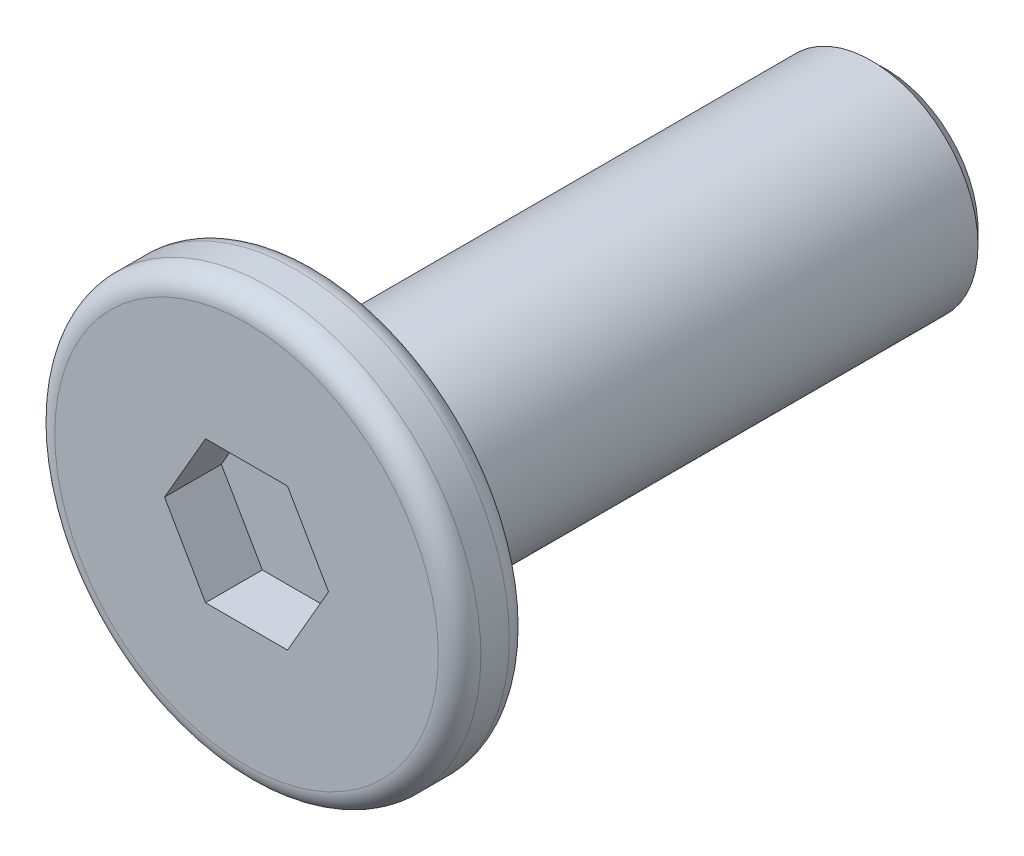
ISO-10303-21;
HEADER;
FILE_DESCRIPTION(('STEP AP214'),'2;1');
FILE_NAME('part.step','',(''),(''),'','','');
FILE_SCHEMA(('AUTOMOTIVE_DESIGN { 1 0 10303 214 1 1 1 1 }'));
ENDSEC;
DATA;
#1=APPLICATION_CONTEXT('core data for automotive mechanical design processes');
#2=APPLICATION_PROTOCOL_DEFINITION('international standard','automotive_design',2000,#1);
#3=PRODUCT_CONTEXT('',#1,'mechanical');
#4=PRODUCT('Part','Part','',(#3));
#5=PRODUCT_RELATED_PRODUCT_CATEGORY('part','',(#4));
#6=PRODUCT_DEFINITION_FORMATION('','',#4);
#7=PRODUCT_DEFINITION_CONTEXT('part definition',#1,'design');
#8=PRODUCT_DEFINITION('design','',#6,#7);
#9=PRODUCT_DEFINITION_SHAPE('','',#8);
#10=(LENGTH_UNIT() NAMED_UNIT(*) SI_UNIT(.MILLI.,.METRE.));
#11=(NAMED_UNIT(*) PLANE_ANGLE_UNIT() SI_UNIT($,.RADIAN.));
#12=(NAMED_UNIT(*) SI_UNIT($,.STERADIAN.) SOLID_ANGLE_UNIT());
#13=UNCERTAINTY_MEASURE_WITH_UNIT(LENGTH_MEASURE(1.E-05),#10,'distance_accuracy_value','');
#14=(GEOMETRIC_REPRESENTATION_CONTEXT(3) GLOBAL_UNCERTAINTY_ASSIGNED_CONTEXT((#13)) GLOBAL_UNIT_ASSIGNED_CONTEXT((#10,
#11,#12)) REPRESENTATION_CONTEXT('',''));
#15=CARTESIAN_POINT('',(0.,0.,0.));
#16=DIRECTION('',(0.,0.,1.));
#17=DIRECTION('',(1.,0.,0.));
#18=AXIS2_PLACEMENT_3D('',#15,#16,#17);
#19=CARTESIAN_POINT('',(0.,0.,0.5));
#20=DIRECTION('',(0.,0.,-1.));
#21=DIRECTION('',(-1.,0.,0.));
#22=AXIS2_PLACEMENT_3D('',#19,#20,#21);
#23=CYLINDRICAL_SURFACE('',#22,3.);
#24=CARTESIAN_POINT('',(0.,0.,-0.2));
#25=DIRECTION('',(0.,0.,1.));
#26=DIRECTION('',(1.,0.,0.));
#27=AXIS2_PLACEMENT_3D('',#24,#25,#26);
#28=CIRCLE('',#27,3.);
#29=CARTESIAN_POINT('',(3.,0.,-0.2));
#30=VERTEX_POINT('',#29);
#31=EDGE_CURVE('E156',#30,#30,#28,.T.);
#32=ORIENTED_EDGE('',*,*,#31,.T.);
#33=EDGE_LOOP('',(#32));
#34=FACE_BOUND('',#33,.T.);
#35=CARTESIAN_POINT('',(0.,0.,0.2));
#36=DIRECTION('',(0.,0.,1.));
#37=DIRECTION('',(1.,0.,0.));
#38=AXIS2_PLACEMENT_3D('',#35,#36,#37);
#39=CIRCLE('',#38,3.);
#40=CARTESIAN_POINT('',(3.,0.,0.2));
#41=VERTEX_POINT('',#40);
#42=EDGE_CURVE('E153',#41,#41,#39,.F.);
#43=ORIENTED_EDGE('',*,*,#42,.T.);
#44=EDGE_LOOP('',(#43));
#45=FACE_BOUND('',#44,.T.);
#46=ADVANCED_FACE('F37',(#34,#45),#23,.T.);
#47=CARTESIAN_POINT('',(0.,0.,0.5));
#48=DIRECTION('',(0.,0.,1.));
#49=DIRECTION('',(1.,0.,0.));
#50=AXIS2_PLACEMENT_3D('',#47,#48,#49);
#51=PLANE('',#50);
#52=CARTESIAN_POINT('',(0.,0.,0.5));
#53=DIRECTION('',(0.,0.,1.));
#54=DIRECTION('',(1.,0.,0.));
#55=AXIS2_PLACEMENT_3D('',#52,#53,#54);
#56=CIRCLE('',#55,2.7);
#57=CARTESIAN_POINT('',(2.7,0.,0.5));
#58=VERTEX_POINT('',#57);
#59=EDGE_CURVE('E11',#58,#58,#56,.T.);
#60=ORIENTED_EDGE('',*,*,#59,.T.);
#61=EDGE_LOOP('',(#60));
#62=FACE_BOUND('',#61,.T.);
#63=DIRECTION('',(0.5,0.866025403784439,0.));
#64=VECTOR('',#63,1.);
#65=CARTESIAN_POINT('',(0.577350269189626,-1.,0.5));
#66=LINE('',#65,#64);
#67=CARTESIAN_POINT('',(0.577350269189626,-1.,0.5));
#68=VERTEX_POINT('',#67);
#69=CARTESIAN_POINT('',(1.15470053837925,0.,0.5));
#70=VERTEX_POINT('',#69);
#71=EDGE_CURVE('E52',#68,#70,#66,.T.);
#72=ORIENTED_EDGE('',*,*,#71,.F.);
#73=DIRECTION('',(1.,0.,0.));
#74=VECTOR('',#73,1.);
#75=CARTESIAN_POINT('',(-0.577350269189625,-1.,0.5));
#76=LINE('',#75,#74);
#77=CARTESIAN_POINT('',(-0.577350269189625,-1.,0.5));
#78=VERTEX_POINT('',#77);
#79=EDGE_CURVE('E135',#78,#68,#76,.T.);
#80=ORIENTED_EDGE('',*,*,#79,.F.);
#81=DIRECTION('',(0.5,-0.866025403784438,0.));
#82=VECTOR('',#81,1.);
#83=CARTESIAN_POINT('',(-1.15470053837925,0.,0.5));
#84=LINE('',#83,#82);
#85=CARTESIAN_POINT('',(-1.15470053837925,0.,0.5));
#86=VERTEX_POINT('',#85);
#87=EDGE_CURVE('E133',#86,#78,#84,.T.);
#88=ORIENTED_EDGE('',*,*,#87,.F.);
#89=DIRECTION('',(-0.5,-0.866025403784438,0.));
#90=VECTOR('',#89,1.);
#91=CARTESIAN_POINT('',(-0.577350269189626,1.,0.5));
#92=LINE('',#91,#90);
#93=CARTESIAN_POINT('',(-0.577350269189626,1.,0.5));
#94=VERTEX_POINT('',#93);
#95=EDGE_CURVE('E100',#94,#86,#92,.T.);
#96=ORIENTED_EDGE('',*,*,#95,.F.);
#97=DIRECTION('',(-1.,0.,0.));
#98=VECTOR('',#97,1.);
#99=CARTESIAN_POINT('',(0.577350269189625,1.,0.5));
#100=LINE('',#99,#98);
#101=CARTESIAN_POINT('',(0.577350269189625,1.,0.5));
#102=VERTEX_POINT('',#101);
#103=EDGE_CURVE('E129',#102,#94,#100,.T.);
#104=ORIENTED_EDGE('',*,*,#103,.F.);
#105=DIRECTION('',(-0.5,0.866025403784438,0.));
#106=VECTOR('',#105,1.);
#107=CARTESIAN_POINT('',(1.15470053837925,0.,0.5));
#108=LINE('',#107,#106);
#109=EDGE_CURVE('E126',#70,#102,#108,.T.);
#110=ORIENTED_EDGE('',*,*,#109,.F.);
#111=EDGE_LOOP('',(#72,#80,#88,#96,#104,#110));
#112=FACE_BOUND('',#111,.T.);
#113=ADVANCED_FACE('F171',(#62,#112),#51,.T.);
#114=CARTESIAN_POINT('',(0.,0.,-0.5));
#115=DIRECTION('',(0.,0.,1.));
#116=DIRECTION('',(1.,0.,0.));
#117=AXIS2_PLACEMENT_3D('',#114,#115,#116);
#118=PLANE('',#117);
#119=CARTESIAN_POINT('',(0.,0.,-0.5));
#120=DIRECTION('',(0.,0.,1.));
#121=DIRECTION('',(1.,0.,0.));
#122=AXIS2_PLACEMENT_3D('',#119,#120,#121);
#123=CIRCLE('',#122,2.7);
#124=CARTESIAN_POINT('',(2.7,0.,-0.5));
#125=VERTEX_POINT('',#124);
#126=EDGE_CURVE('E45',#125,#125,#123,.F.);
#127=ORIENTED_EDGE('',*,*,#126,.T.);
#128=EDGE_LOOP('',(#127));
#129=FACE_BOUND('',#128,.T.);
#130=CARTESIAN_POINT('',(0.,0.,-0.5));
#131=DIRECTION('',(0.,0.,-1.));
#132=DIRECTION('',(-1.,0.,0.));
#133=AXIS2_PLACEMENT_3D('',#130,#131,#132);
#134=CIRCLE('',#133,1.5);
#135=CARTESIAN_POINT('',(-1.5,0.,-0.5));
#136=VERTEX_POINT('',#135);
#137=EDGE_CURVE('E139',#136,#136,#134,.T.);
#138=ORIENTED_EDGE('',*,*,#137,.F.);
#139=EDGE_LOOP('',(#138));
#140=FACE_BOUND('',#139,.T.);
#141=ADVANCED_FACE('F161',(#129,#140),#118,.F.);
#142=CARTESIAN_POINT('',(0.,0.,-8.5));
#143=DIRECTION('',(0.,0.,1.));
#144=DIRECTION('',(1.,0.,0.));
#145=AXIS2_PLACEMENT_3D('',#142,#143,#144);
#146=CYLINDRICAL_SURFACE('',#145,1.5);
#147=CARTESIAN_POINT('',(0.,0.,-8.3));
#148=DIRECTION('',(0.,0.,-1.));
#149=DIRECTION('',(-1.,0.,0.));
#150=AXIS2_PLACEMENT_3D('',#147,#148,#149);
#151=CIRCLE('',#150,1.5);
#152=CARTESIAN_POINT('',(-1.5,0.,-8.3));
#153=VERTEX_POINT('',#152);
#154=EDGE_CURVE('E150',#153,#153,#151,.F.);
#155=ORIENTED_EDGE('',*,*,#154,.T.);
#156=EDGE_LOOP('',(#155));
#157=FACE_BOUND('',#156,.T.);
#158=ORIENTED_EDGE('',*,*,#137,.T.);
#159=EDGE_LOOP('',(#158));
#160=FACE_BOUND('',#159,.T.);
#161=ADVANCED_FACE('F206',(#157,#160),#146,.T.);
#162=CARTESIAN_POINT('',(0.,0.,-8.5));
#163=DIRECTION('',(0.,0.,-1.));
#164=DIRECTION('',(-1.,0.,0.));
#165=AXIS2_PLACEMENT_3D('',#162,#163,#164);
#166=PLANE('',#165);
#167=CARTESIAN_POINT('',(0.,0.,-8.5));
#168=DIRECTION('',(0.,0.,-1.));
#169=DIRECTION('',(-1.,0.,0.));
#170=AXIS2_PLACEMENT_3D('',#167,#168,#169);
#171=CIRCLE('',#170,1.3);
#172=CARTESIAN_POINT('',(-1.3,0.,-8.5));
#173=VERTEX_POINT('',#172);
#174=EDGE_CURVE('E147',#173,#173,#171,.T.);
#175=ORIENTED_EDGE('',*,*,#174,.T.);
#176=EDGE_LOOP('',(#175));
#177=FACE_BOUND('',#176,.T.);
#178=ADVANCED_FACE('F198',(#177),#166,.T.);
#179=CARTESIAN_POINT('',(0.,0.,-8.5));
#180=DIRECTION('',(0.,0.,1.));
#181=DIRECTION('',(1.,0.,0.));
#182=AXIS2_PLACEMENT_3D('',#179,#180,#181);
#183=CONICAL_SURFACE('',#182,1.3,0.78539816339745);
#184=ORIENTED_EDGE('',*,*,#154,.F.);
#185=EDGE_LOOP('',(#184));
#186=FACE_BOUND('',#185,.T.);
#187=ORIENTED_EDGE('',*,*,#174,.F.);
#188=EDGE_LOOP('',(#187));
#189=FACE_BOUND('',#188,.T.);
#190=ADVANCED_FACE('F191',(#186,#189),#183,.T.);
#191=CARTESIAN_POINT('',(0.577350269189626,-1.,-0.3));
#192=DIRECTION('',(0.866025403784439,-0.5,0.));
#193=DIRECTION('',(0.5,0.866025403784439,0.));
#194=AXIS2_PLACEMENT_3D('',#191,#192,#193);
#195=PLANE('',#194);
#196=ORIENTED_EDGE('',*,*,#71,.T.);
#197=DIRECTION('',(0.,0.,1.));
#198=VECTOR('',#197,1.);
#199=CARTESIAN_POINT('',(1.15470053837925,0.,-0.3));
#200=LINE('',#199,#198);
#201=CARTESIAN_POINT('',(1.15470053837925,0.,-0.3));
#202=VERTEX_POINT('',#201);
#203=EDGE_CURVE('E82',#202,#70,#200,.T.);
#204=ORIENTED_EDGE('',*,*,#203,.F.);
#205=DIRECTION('',(0.5,0.866025403784439,0.));
#206=VECTOR('',#205,1.);
#207=CARTESIAN_POINT('',(0.577350269189626,-1.,-0.3));
#208=LINE('',#207,#206);
#209=CARTESIAN_POINT('',(0.577350269189626,-1.,-0.3));
#210=VERTEX_POINT('',#209);
#211=EDGE_CURVE('E137',#210,#202,#208,.T.);
#212=ORIENTED_EDGE('',*,*,#211,.F.);
#213=DIRECTION('',(0.,0.,1.));
#214=VECTOR('',#213,1.);
#215=CARTESIAN_POINT('',(0.577350269189626,-1.,-0.3));
#216=LINE('',#215,#214);
#217=EDGE_CURVE('E60',#210,#68,#216,.T.);
#218=ORIENTED_EDGE('',*,*,#217,.T.);
#219=EDGE_LOOP('',(#196,#204,#212,#218));
#220=FACE_BOUND('',#219,.T.);
#221=ADVANCED_FACE('F188',(#220),#195,.F.);
#222=CARTESIAN_POINT('',(-0.577350269189625,-1.,-0.3));
#223=DIRECTION('',(0.,-1.,0.));
#224=DIRECTION('',(1.,0.,0.));
#225=AXIS2_PLACEMENT_3D('',#222,#223,#224);
#226=PLANE('',#225);
#227=ORIENTED_EDGE('',*,*,#79,.T.);
#228=ORIENTED_EDGE('',*,*,#217,.F.);
#229=DIRECTION('',(1.,0.,0.));
#230=VECTOR('',#229,1.);
#231=CARTESIAN_POINT('',(-0.577350269189625,-1.,-0.3));
#232=LINE('',#231,#230);
#233=CARTESIAN_POINT('',(-0.577350269189625,-1.,-0.3));
#234=VERTEX_POINT('',#233);
#235=EDGE_CURVE('E112',#234,#210,#232,.T.);
#236=ORIENTED_EDGE('',*,*,#235,.F.);
#237=DIRECTION('',(0.,0.,1.));
#238=VECTOR('',#237,1.);
#239=CARTESIAN_POINT('',(-0.577350269189625,-1.,-0.3));
#240=LINE('',#239,#238);
#241=EDGE_CURVE('E104',#234,#78,#240,.T.);
#242=ORIENTED_EDGE('',*,*,#241,.T.);
#243=EDGE_LOOP('',(#227,#228,#236,#242));
#244=FACE_BOUND('',#243,.T.);
#245=ADVANCED_FACE('F190',(#244),#226,.F.);
#246=CARTESIAN_POINT('',(-1.15470053837925,0.,-0.3));
#247=DIRECTION('',(-0.866025403784438,-0.5,0.));
#248=DIRECTION('',(0.5,-0.866025403784438,0.));
#249=AXIS2_PLACEMENT_3D('',#246,#247,#248);
#250=PLANE('',#249);
#251=ORIENTED_EDGE('',*,*,#87,.T.);
#252=ORIENTED_EDGE('',*,*,#241,.F.);
#253=DIRECTION('',(0.5,-0.866025403784438,0.));
#254=VECTOR('',#253,1.);
#255=CARTESIAN_POINT('',(-1.15470053837925,0.,-0.3));
#256=LINE('',#255,#254);
#257=CARTESIAN_POINT('',(-1.15470053837925,0.,-0.3));
#258=VERTEX_POINT('',#257);
#259=EDGE_CURVE('E108',#258,#234,#256,.T.);
#260=ORIENTED_EDGE('',*,*,#259,.F.);
#261=DIRECTION('',(0.,0.,1.));
#262=VECTOR('',#261,1.);
#263=CARTESIAN_POINT('',(-1.15470053837925,0.,-0.3));
#264=LINE('',#263,#262);
#265=EDGE_CURVE('E93',#258,#86,#264,.T.);
#266=ORIENTED_EDGE('',*,*,#265,.T.);
#267=EDGE_LOOP('',(#251,#252,#260,#266));
#268=FACE_BOUND('',#267,.T.);
#269=ADVANCED_FACE('F109',(#268),#250,.F.);
#270=CARTESIAN_POINT('',(-0.577350269189626,1.,-0.3));
#271=DIRECTION('',(-0.866025403784438,0.5,0.));
#272=DIRECTION('',(-0.5,-0.866025403784439,0.));
#273=AXIS2_PLACEMENT_3D('',#270,#271,#272);
#274=PLANE('',#273);
#275=ORIENTED_EDGE('',*,*,#95,.T.);
#276=ORIENTED_EDGE('',*,*,#265,.F.);
#277=DIRECTION('',(-0.5,-0.866025403784438,0.));
#278=VECTOR('',#277,1.);
#279=CARTESIAN_POINT('',(-0.577350269189626,1.,-0.3));
#280=LINE('',#279,#278);
#281=CARTESIAN_POINT('',(-0.577350269189626,1.,-0.3));
#282=VERTEX_POINT('',#281);
#283=EDGE_CURVE('E97',#282,#258,#280,.T.);
#284=ORIENTED_EDGE('',*,*,#283,.F.);
#285=DIRECTION('',(0.,0.,1.));
#286=VECTOR('',#285,1.);
#287=CARTESIAN_POINT('',(-0.577350269189626,1.,-0.3));
#288=LINE('',#287,#286);
#289=EDGE_CURVE('E105',#282,#94,#288,.T.);
#290=ORIENTED_EDGE('',*,*,#289,.T.);
#291=EDGE_LOOP('',(#275,#276,#284,#290));
#292=FACE_BOUND('',#291,.T.);
#293=ADVANCED_FACE('F95',(#292),#274,.F.);
#294=CARTESIAN_POINT('',(0.577350269189625,1.,-0.3));
#295=DIRECTION('',(0.,1.,0.));
#296=DIRECTION('',(0.,0.,1.));
#297=AXIS2_PLACEMENT_3D('',#294,#295,#296);
#298=PLANE('',#297);
#299=ORIENTED_EDGE('',*,*,#103,.T.);
#300=ORIENTED_EDGE('',*,*,#289,.F.);
#301=DIRECTION('',(-1.,0.,0.));
#302=VECTOR('',#301,1.);
#303=CARTESIAN_POINT('',(0.577350269189625,1.,-0.3));
#304=LINE('',#303,#302);
#305=CARTESIAN_POINT('',(0.577350269189625,1.,-0.3));
#306=VERTEX_POINT('',#305);
#307=EDGE_CURVE('E118',#306,#282,#304,.T.);
#308=ORIENTED_EDGE('',*,*,#307,.F.);
#309=DIRECTION('',(0.,0.,1.));
#310=VECTOR('',#309,1.);
#311=CARTESIAN_POINT('',(0.577350269189625,1.,-0.3));
#312=LINE('',#311,#310);
#313=EDGE_CURVE('E142',#306,#102,#312,.T.);
#314=ORIENTED_EDGE('',*,*,#313,.T.);
#315=EDGE_LOOP('',(#299,#300,#308,#314));
#316=FACE_BOUND('',#315,.T.);
#317=ADVANCED_FACE('F259',(#316),#298,.F.);
#318=CARTESIAN_POINT('',(1.15470053837925,0.,-0.3));
#319=DIRECTION('',(0.866025403784438,0.5,0.));
#320=DIRECTION('',(-0.5,0.866025403784439,0.));
#321=AXIS2_PLACEMENT_3D('',#318,#319,#320);
#322=PLANE('',#321);
#323=ORIENTED_EDGE('',*,*,#109,.T.);
#324=ORIENTED_EDGE('',*,*,#313,.F.);
#325=DIRECTION('',(-0.5,0.866025403784438,0.));
#326=VECTOR('',#325,1.);
#327=CARTESIAN_POINT('',(1.15470053837925,0.,-0.3));
#328=LINE('',#327,#326);
#329=EDGE_CURVE('E120',#202,#306,#328,.T.);
#330=ORIENTED_EDGE('',*,*,#329,.F.);
#331=ORIENTED_EDGE('',*,*,#203,.T.);
#332=EDGE_LOOP('',(#323,#324,#330,#331));
#333=FACE_BOUND('',#332,.T.);
#334=ADVANCED_FACE('F186',(#333),#322,.F.);
#335=CARTESIAN_POINT('',(0.,0.,-0.3));
#336=DIRECTION('',(0.,0.,1.));
#337=DIRECTION('',(1.,0.,0.));
#338=AXIS2_PLACEMENT_3D('',#335,#336,#337);
#339=PLANE('',#338);
#340=ORIENTED_EDGE('',*,*,#211,.T.);
#341=ORIENTED_EDGE('',*,*,#329,.T.);
#342=ORIENTED_EDGE('',*,*,#307,.T.);
#343=ORIENTED_EDGE('',*,*,#283,.T.);
#344=ORIENTED_EDGE('',*,*,#259,.T.);
#345=ORIENTED_EDGE('',*,*,#235,.T.);
#346=EDGE_LOOP('',(#340,#341,#342,#343,#344,#345));
#347=FACE_BOUND('',#346,.T.);
#348=ADVANCED_FACE('F115',(#347),#339,.T.);
#349=CARTESIAN_POINT('',(0.,0.,-0.2));
#350=DIRECTION('',(0.,0.,1.));
#351=DIRECTION('',(1.,0.,0.));
#352=AXIS2_PLACEMENT_3D('',#349,#350,#351);
#353=TOROIDAL_SURFACE('',#352,2.7,0.3);
#354=ORIENTED_EDGE('',*,*,#126,.F.);
#355=EDGE_LOOP('',(#354));
#356=FACE_BOUND('',#355,.T.);
#357=ORIENTED_EDGE('',*,*,#31,.F.);
#358=EDGE_LOOP('',(#357));
#359=FACE_BOUND('',#358,.T.);
#360=ADVANCED_FACE('F164',(#356,#359),#353,.T.);
#361=CARTESIAN_POINT('',(0.,0.,0.2));
#362=DIRECTION('',(0.,0.,1.));
#363=DIRECTION('',(1.,0.,0.));
#364=AXIS2_PLACEMENT_3D('',#361,#362,#363);
#365=TOROIDAL_SURFACE('',#364,2.7,0.3);
#366=ORIENTED_EDGE('',*,*,#42,.F.);
#367=EDGE_LOOP('',(#366));
#368=FACE_BOUND('',#367,.T.);
#369=ORIENTED_EDGE('',*,*,#59,.F.);
#370=EDGE_LOOP('',(#369));
#371=FACE_BOUND('',#370,.T.);
#372=ADVANCED_FACE('F39',(#368,#371),#365,.T.);
#373=CLOSED_SHELL('',(#46,#113,#141,#161,#178,#190,#221,#245,#269,#293,#317,#334,#348,#360,#372));
#374=MANIFOLD_SOLID_BREP('B2',#373);
#375=ADVANCED_BREP_SHAPE_REPRESENTATION('',(#18,#374),#14);
#376=SHAPE_DEFINITION_REPRESENTATION(#9,#375);
ENDSEC;
END-ISO-10303-21;
